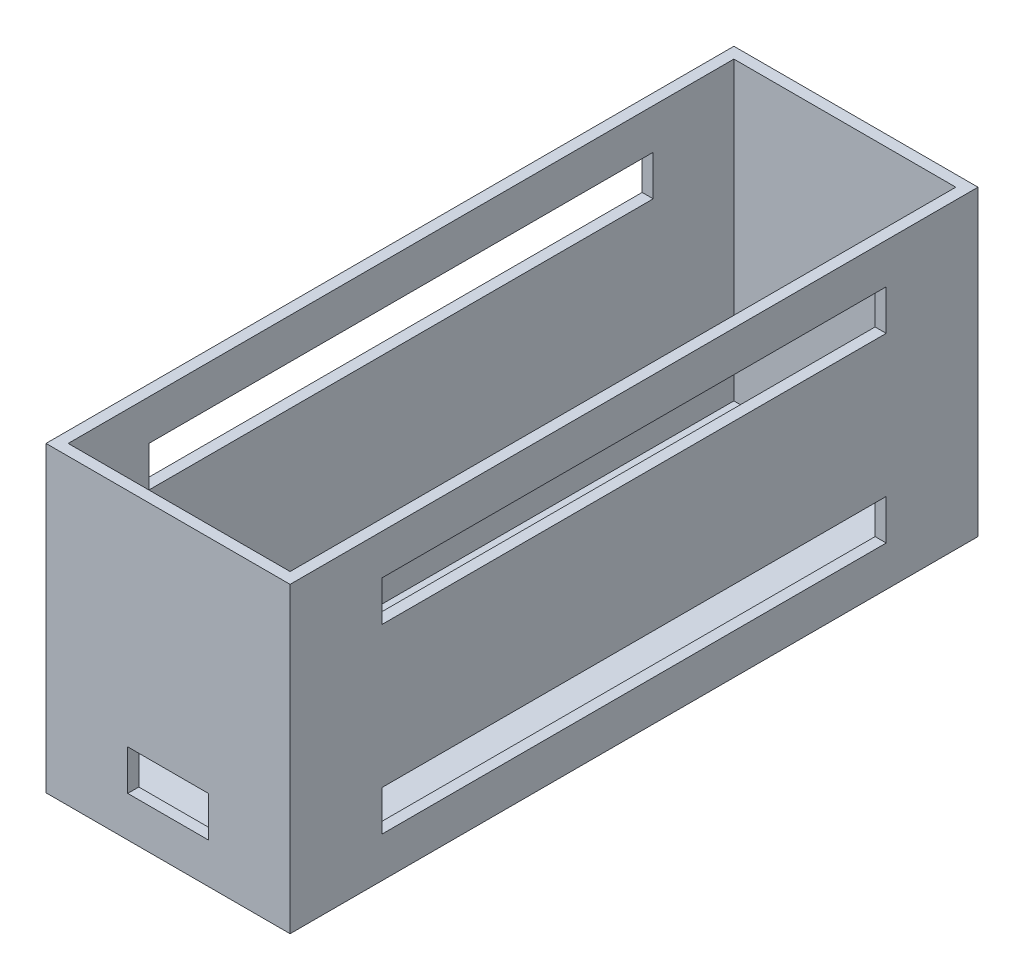
ISO-10303-21;
HEADER;
FILE_DESCRIPTION(('STEP AP214'),'2;1');
FILE_NAME('part.step','',(''),(''),'','','');
FILE_SCHEMA(('AUTOMOTIVE_DESIGN { 1 0 10303 214 1 1 1 1 }'));
ENDSEC;
DATA;
#1=APPLICATION_CONTEXT('core data for automotive mechanical design processes');
#2=APPLICATION_PROTOCOL_DEFINITION('international standard','automotive_design',2000,#1);
#3=PRODUCT_CONTEXT('',#1,'mechanical');
#4=PRODUCT('Part','Part','',(#3));
#5=PRODUCT_RELATED_PRODUCT_CATEGORY('part','',(#4));
#6=PRODUCT_DEFINITION_FORMATION('','',#4);
#7=PRODUCT_DEFINITION_CONTEXT('part definition',#1,'design');
#8=PRODUCT_DEFINITION('design','',#6,#7);
#9=PRODUCT_DEFINITION_SHAPE('','',#8);
#10=(LENGTH_UNIT() NAMED_UNIT(*) SI_UNIT(.MILLI.,.METRE.));
#11=(NAMED_UNIT(*) PLANE_ANGLE_UNIT() SI_UNIT($,.RADIAN.));
#12=(NAMED_UNIT(*) SI_UNIT($,.STERADIAN.) SOLID_ANGLE_UNIT());
#13=UNCERTAINTY_MEASURE_WITH_UNIT(LENGTH_MEASURE(1.E-05),#10,'distance_accuracy_value','');
#14=(GEOMETRIC_REPRESENTATION_CONTEXT(3) GLOBAL_UNCERTAINTY_ASSIGNED_CONTEXT((#13)) GLOBAL_UNIT_ASSIGNED_CONTEXT((#10,
#11,#12)) REPRESENTATION_CONTEXT('',''));
#15=CARTESIAN_POINT('',(0.,0.,0.));
#16=DIRECTION('',(0.,0.,1.));
#17=DIRECTION('',(1.,0.,0.));
#18=AXIS2_PLACEMENT_3D('',#15,#16,#17);
#19=CARTESIAN_POINT('',(-30.25,-37.5,85.25));
#20=DIRECTION('',(1.,0.,0.));
#21=DIRECTION('',(0.,0.,-1.));
#22=AXIS2_PLACEMENT_3D('',#19,#20,#21);
#23=PLANE('',#22);
#24=DIRECTION('',(0.,-1.,0.));
#25=VECTOR('',#24,1.);
#26=CARTESIAN_POINT('',(-30.25,-37.5,-85.25));
#27=LINE('',#26,#25);
#28=CARTESIAN_POINT('',(-30.25,37.5,-85.25));
#29=VERTEX_POINT('',#28);
#30=CARTESIAN_POINT('',(-30.25,-37.5,-85.25));
#31=VERTEX_POINT('',#30);
#32=EDGE_CURVE('E443',#29,#31,#27,.T.);
#33=ORIENTED_EDGE('',*,*,#32,.T.);
#34=DIRECTION('',(0.,0.,-1.));
#35=VECTOR('',#34,1.);
#36=CARTESIAN_POINT('',(-30.25,-37.5,85.25));
#37=LINE('',#36,#35);
#38=CARTESIAN_POINT('',(-30.25,-37.5,85.25));
#39=VERTEX_POINT('',#38);
#40=EDGE_CURVE('E490',#39,#31,#37,.T.);
#41=ORIENTED_EDGE('',*,*,#40,.F.);
#42=DIRECTION('',(0.,-1.,0.));
#43=VECTOR('',#42,1.);
#44=CARTESIAN_POINT('',(-30.25,-37.5,85.25));
#45=LINE('',#44,#43);
#46=CARTESIAN_POINT('',(-30.25,37.5,85.25));
#47=VERTEX_POINT('',#46);
#48=EDGE_CURVE('E453',#47,#39,#45,.T.);
#49=ORIENTED_EDGE('',*,*,#48,.F.);
#50=DIRECTION('',(0.,0.,-1.));
#51=VECTOR('',#50,1.);
#52=CARTESIAN_POINT('',(-30.25,37.5,85.25));
#53=LINE('',#52,#51);
#54=EDGE_CURVE('E467',#47,#29,#53,.T.);
#55=ORIENTED_EDGE('',*,*,#54,.T.);
#56=EDGE_LOOP('',(#33,#41,#49,#55));
#57=FACE_BOUND('',#56,.T.);
#58=DIRECTION('',(0.,1.,0.));
#59=VECTOR('',#58,1.);
#60=CARTESIAN_POINT('',(-30.25,-27.5,-62.5));
#61=LINE('',#60,#59);
#62=CARTESIAN_POINT('',(-30.25,-27.5,-62.5));
#63=VERTEX_POINT('',#62);
#64=CARTESIAN_POINT('',(-30.25,-17.5,-62.5));
#65=VERTEX_POINT('',#64);
#66=EDGE_CURVE('E320',#63,#65,#61,.T.);
#67=ORIENTED_EDGE('',*,*,#66,.T.);
#68=DIRECTION('',(0.,0.,-1.));
#69=VECTOR('',#68,1.);
#70=CARTESIAN_POINT('',(-30.25,-17.5,62.5));
#71=LINE('',#70,#69);
#72=CARTESIAN_POINT('',(-30.25,-17.5,62.5));
#73=VERTEX_POINT('',#72);
#74=EDGE_CURVE('E68',#73,#65,#71,.T.);
#75=ORIENTED_EDGE('',*,*,#74,.F.);
#76=DIRECTION('',(0.,1.,0.));
#77=VECTOR('',#76,1.);
#78=CARTESIAN_POINT('',(-30.25,-27.5,62.5));
#79=LINE('',#78,#77);
#80=CARTESIAN_POINT('',(-30.25,-27.5,62.5));
#81=VERTEX_POINT('',#80);
#82=EDGE_CURVE('E311',#81,#73,#79,.T.);
#83=ORIENTED_EDGE('',*,*,#82,.F.);
#84=DIRECTION('',(0.,0.,-1.));
#85=VECTOR('',#84,1.);
#86=CARTESIAN_POINT('',(-30.25,-27.5,62.5));
#87=LINE('',#86,#85);
#88=EDGE_CURVE('E315',#81,#63,#87,.T.);
#89=ORIENTED_EDGE('',*,*,#88,.T.);
#90=EDGE_LOOP('',(#67,#75,#83,#89));
#91=FACE_BOUND('',#90,.T.);
#92=DIRECTION('',(0.,-1.,0.));
#93=VECTOR('',#92,1.);
#94=CARTESIAN_POINT('',(-30.25,27.5,62.5));
#95=LINE('',#94,#93);
#96=CARTESIAN_POINT('',(-30.25,27.5,62.5));
#97=VERTEX_POINT('',#96);
#98=CARTESIAN_POINT('',(-30.25,17.5,62.5));
#99=VERTEX_POINT('',#98);
#100=EDGE_CURVE('E60',#97,#99,#95,.T.);
#101=ORIENTED_EDGE('',*,*,#100,.T.);
#102=DIRECTION('',(0.,0.,-1.));
#103=VECTOR('',#102,1.);
#104=CARTESIAN_POINT('',(-30.25,17.5,62.5));
#105=LINE('',#104,#103);
#106=CARTESIAN_POINT('',(-30.25,17.5,-62.5));
#107=VERTEX_POINT('',#106);
#108=EDGE_CURVE('E269',#99,#107,#105,.T.);
#109=ORIENTED_EDGE('',*,*,#108,.T.);
#110=DIRECTION('',(0.,-1.,0.));
#111=VECTOR('',#110,1.);
#112=CARTESIAN_POINT('',(-30.25,27.5,-62.5));
#113=LINE('',#112,#111);
#114=CARTESIAN_POINT('',(-30.25,27.5,-62.5));
#115=VERTEX_POINT('',#114);
#116=EDGE_CURVE('E273',#115,#107,#113,.T.);
#117=ORIENTED_EDGE('',*,*,#116,.F.);
#118=DIRECTION('',(0.,0.,-1.));
#119=VECTOR('',#118,1.);
#120=CARTESIAN_POINT('',(-30.25,27.5,62.5));
#121=LINE('',#120,#119);
#122=EDGE_CURVE('E244',#97,#115,#121,.T.);
#123=ORIENTED_EDGE('',*,*,#122,.F.);
#124=EDGE_LOOP('',(#101,#109,#117,#123));
#125=FACE_BOUND('',#124,.T.);
#126=ADVANCED_FACE('F45',(#57,#91,#125),#23,.F.);
#127=CARTESIAN_POINT('',(30.25,-37.5,85.25));
#128=DIRECTION('',(-1.,0.,0.));
#129=DIRECTION('',(0.,0.,1.));
#130=AXIS2_PLACEMENT_3D('',#127,#128,#129);
#131=PLANE('',#130);
#132=DIRECTION('',(0.,1.,0.));
#133=VECTOR('',#132,1.);
#134=CARTESIAN_POINT('',(30.25,-37.5,-85.25));
#135=LINE('',#134,#133);
#136=CARTESIAN_POINT('',(30.25,-37.5,-85.25));
#137=VERTEX_POINT('',#136);
#138=CARTESIAN_POINT('',(30.25,37.5,-85.25));
#139=VERTEX_POINT('',#138);
#140=EDGE_CURVE('E474',#137,#139,#135,.T.);
#141=ORIENTED_EDGE('',*,*,#140,.T.);
#142=DIRECTION('',(0.,0.,-1.));
#143=VECTOR('',#142,1.);
#144=CARTESIAN_POINT('',(30.25,37.5,85.25));
#145=LINE('',#144,#143);
#146=CARTESIAN_POINT('',(30.25,37.5,85.25));
#147=VERTEX_POINT('',#146);
#148=EDGE_CURVE('E482',#147,#139,#145,.T.);
#149=ORIENTED_EDGE('',*,*,#148,.F.);
#150=DIRECTION('',(0.,1.,0.));
#151=VECTOR('',#150,1.);
#152=CARTESIAN_POINT('',(30.25,-37.5,85.25));
#153=LINE('',#152,#151);
#154=CARTESIAN_POINT('',(30.25,-37.5,85.25));
#155=VERTEX_POINT('',#154);
#156=EDGE_CURVE('E461',#155,#147,#153,.T.);
#157=ORIENTED_EDGE('',*,*,#156,.F.);
#158=DIRECTION('',(0.,0.,-1.));
#159=VECTOR('',#158,1.);
#160=CARTESIAN_POINT('',(30.25,-37.5,85.25));
#161=LINE('',#160,#159);
#162=EDGE_CURVE('E486',#155,#137,#161,.T.);
#163=ORIENTED_EDGE('',*,*,#162,.T.);
#164=EDGE_LOOP('',(#141,#149,#157,#163));
#165=FACE_BOUND('',#164,.T.);
#166=DIRECTION('',(0.,1.,0.));
#167=VECTOR('',#166,1.);
#168=CARTESIAN_POINT('',(30.25,-27.5,62.5));
#169=LINE('',#168,#167);
#170=CARTESIAN_POINT('',(30.25,-27.5,62.5));
#171=VERTEX_POINT('',#170);
#172=CARTESIAN_POINT('',(30.25,-17.5,62.5));
#173=VERTEX_POINT('',#172);
#174=EDGE_CURVE('E294',#171,#173,#169,.T.);
#175=ORIENTED_EDGE('',*,*,#174,.T.);
#176=DIRECTION('',(0.,0.,-1.));
#177=VECTOR('',#176,1.);
#178=CARTESIAN_POINT('',(30.25,-17.5,62.5));
#179=LINE('',#178,#177);
#180=CARTESIAN_POINT('',(30.25,-17.5,-62.5));
#181=VERTEX_POINT('',#180);
#182=EDGE_CURVE('E316',#173,#181,#179,.T.);
#183=ORIENTED_EDGE('',*,*,#182,.T.);
#184=DIRECTION('',(0.,1.,0.));
#185=VECTOR('',#184,1.);
#186=CARTESIAN_POINT('',(30.25,-27.5,-62.5));
#187=LINE('',#186,#185);
#188=CARTESIAN_POINT('',(30.25,-27.5,-62.5));
#189=VERTEX_POINT('',#188);
#190=EDGE_CURVE('E333',#189,#181,#187,.T.);
#191=ORIENTED_EDGE('',*,*,#190,.F.);
#192=DIRECTION('',(0.,0.,-1.));
#193=VECTOR('',#192,1.);
#194=CARTESIAN_POINT('',(30.25,-27.5,62.5));
#195=LINE('',#194,#193);
#196=EDGE_CURVE('E329',#171,#189,#195,.T.);
#197=ORIENTED_EDGE('',*,*,#196,.F.);
#198=EDGE_LOOP('',(#175,#183,#191,#197));
#199=FACE_BOUND('',#198,.T.);
#200=DIRECTION('',(0.,-1.,0.));
#201=VECTOR('',#200,1.);
#202=CARTESIAN_POINT('',(30.25,27.5,62.5));
#203=LINE('',#202,#201);
#204=CARTESIAN_POINT('',(30.25,27.5,62.5));
#205=VERTEX_POINT('',#204);
#206=CARTESIAN_POINT('',(30.25,17.5,62.5));
#207=VERTEX_POINT('',#206);
#208=EDGE_CURVE('E232',#205,#207,#203,.T.);
#209=ORIENTED_EDGE('',*,*,#208,.F.);
#210=DIRECTION('',(0.,0.,-1.));
#211=VECTOR('',#210,1.);
#212=CARTESIAN_POINT('',(30.25,27.5,62.5));
#213=LINE('',#212,#211);
#214=CARTESIAN_POINT('',(30.25,27.5,-62.5));
#215=VERTEX_POINT('',#214);
#216=EDGE_CURVE('E261',#205,#215,#213,.T.);
#217=ORIENTED_EDGE('',*,*,#216,.T.);
#218=DIRECTION('',(0.,-1.,0.));
#219=VECTOR('',#218,1.);
#220=CARTESIAN_POINT('',(30.25,27.5,-62.5));
#221=LINE('',#220,#219);
#222=CARTESIAN_POINT('',(30.25,17.5,-62.5));
#223=VERTEX_POINT('',#222);
#224=EDGE_CURVE('E257',#215,#223,#221,.T.);
#225=ORIENTED_EDGE('',*,*,#224,.T.);
#226=DIRECTION('',(0.,0.,-1.));
#227=VECTOR('',#226,1.);
#228=CARTESIAN_POINT('',(30.25,17.5,62.5));
#229=LINE('',#228,#227);
#230=EDGE_CURVE('E243',#207,#223,#229,.T.);
#231=ORIENTED_EDGE('',*,*,#230,.F.);
#232=EDGE_LOOP('',(#209,#217,#225,#231));
#233=FACE_BOUND('',#232,.T.);
#234=ADVANCED_FACE('F256',(#165,#199,#233),#131,.F.);
#235=CARTESIAN_POINT('',(-27.5,-35.875,82.5));
#236=DIRECTION('',(-1.,0.,0.));
#237=DIRECTION('',(0.,-1.,0.));
#238=AXIS2_PLACEMENT_3D('',#235,#236,#237);
#239=PLANE('',#238);
#240=DIRECTION('',(0.,0.,1.));
#241=VECTOR('',#240,1.);
#242=CARTESIAN_POINT('',(-27.5,37.5,82.5));
#243=LINE('',#242,#241);
#244=CARTESIAN_POINT('',(-27.5,37.5,-82.5));
#245=VERTEX_POINT('',#244);
#246=CARTESIAN_POINT('',(-27.5,37.5,82.5));
#247=VERTEX_POINT('',#246);
#248=EDGE_CURVE('E408',#245,#247,#243,.T.);
#249=ORIENTED_EDGE('',*,*,#248,.T.);
#250=DIRECTION('',(0.,1.,0.));
#251=VECTOR('',#250,1.);
#252=CARTESIAN_POINT('',(-27.5,-35.875,82.5));
#253=LINE('',#252,#251);
#254=CARTESIAN_POINT('',(-27.5,-35.875,82.5));
#255=VERTEX_POINT('',#254);
#256=EDGE_CURVE('E426',#255,#247,#253,.T.);
#257=ORIENTED_EDGE('',*,*,#256,.F.);
#258=DIRECTION('',(0.,0.,1.));
#259=VECTOR('',#258,1.);
#260=CARTESIAN_POINT('',(-27.5,-35.875,82.5));
#261=LINE('',#260,#259);
#262=CARTESIAN_POINT('',(-27.5,-35.875,-82.5));
#263=VERTEX_POINT('',#262);
#264=EDGE_CURVE('E409',#263,#255,#261,.T.);
#265=ORIENTED_EDGE('',*,*,#264,.F.);
#266=DIRECTION('',(0.,1.,0.));
#267=VECTOR('',#266,1.);
#268=CARTESIAN_POINT('',(-27.5,-35.875,-82.5));
#269=LINE('',#268,#267);
#270=EDGE_CURVE('E440',#263,#245,#269,.T.);
#271=ORIENTED_EDGE('',*,*,#270,.T.);
#272=EDGE_LOOP('',(#249,#257,#265,#271));
#273=FACE_BOUND('',#272,.T.);
#274=DIRECTION('',(0.,1.,0.));
#275=VECTOR('',#274,1.);
#276=CARTESIAN_POINT('',(-27.5,-35.875,62.5));
#277=LINE('',#276,#275);
#278=CARTESIAN_POINT('',(-27.5,-27.5,62.5));
#279=VERTEX_POINT('',#278);
#280=CARTESIAN_POINT('',(-27.5,-17.5,62.5));
#281=VERTEX_POINT('',#280);
#282=EDGE_CURVE('E345',#279,#281,#277,.T.);
#283=ORIENTED_EDGE('',*,*,#282,.T.);
#284=DIRECTION('',(0.,0.,-1.));
#285=VECTOR('',#284,1.);
#286=CARTESIAN_POINT('',(-27.5,-17.5,82.5));
#287=LINE('',#286,#285);
#288=CARTESIAN_POINT('',(-27.5,-17.5,-62.5));
#289=VERTEX_POINT('',#288);
#290=EDGE_CURVE('E349',#281,#289,#287,.T.);
#291=ORIENTED_EDGE('',*,*,#290,.T.);
#292=DIRECTION('',(0.,1.,0.));
#293=VECTOR('',#292,1.);
#294=CARTESIAN_POINT('',(-27.5,-35.875,-62.5));
#295=LINE('',#294,#293);
#296=CARTESIAN_POINT('',(-27.5,-27.5,-62.5));
#297=VERTEX_POINT('',#296);
#298=EDGE_CURVE('E252',#297,#289,#295,.T.);
#299=ORIENTED_EDGE('',*,*,#298,.F.);
#300=DIRECTION('',(0.,0.,-1.));
#301=VECTOR('',#300,1.);
#302=CARTESIAN_POINT('',(-27.5,-27.5,82.5));
#303=LINE('',#302,#301);
#304=EDGE_CURVE('E341',#279,#297,#303,.T.);
#305=ORIENTED_EDGE('',*,*,#304,.F.);
#306=EDGE_LOOP('',(#283,#291,#299,#305));
#307=FACE_BOUND('',#306,.T.);
#308=DIRECTION('',(0.,-1.,0.));
#309=VECTOR('',#308,1.);
#310=CARTESIAN_POINT('',(-27.5,-35.875,62.5));
#311=LINE('',#310,#309);
#312=CARTESIAN_POINT('',(-27.5,27.5,62.5));
#313=VERTEX_POINT('',#312);
#314=CARTESIAN_POINT('',(-27.5,17.5,62.5));
#315=VERTEX_POINT('',#314);
#316=EDGE_CURVE('E364',#313,#315,#311,.T.);
#317=ORIENTED_EDGE('',*,*,#316,.F.);
#318=DIRECTION('',(0.,0.,-1.));
#319=VECTOR('',#318,1.);
#320=CARTESIAN_POINT('',(-27.5,27.5,82.5));
#321=LINE('',#320,#319);
#322=CARTESIAN_POINT('',(-27.5,27.5,-62.5));
#323=VERTEX_POINT('',#322);
#324=EDGE_CURVE('E353',#313,#323,#321,.T.);
#325=ORIENTED_EDGE('',*,*,#324,.T.);
#326=DIRECTION('',(0.,-1.,0.));
#327=VECTOR('',#326,1.);
#328=CARTESIAN_POINT('',(-27.5,-35.875,-62.5));
#329=LINE('',#328,#327);
#330=CARTESIAN_POINT('',(-27.5,17.5,-62.5));
#331=VERTEX_POINT('',#330);
#332=EDGE_CURVE('E357',#323,#331,#329,.T.);
#333=ORIENTED_EDGE('',*,*,#332,.T.);
#334=DIRECTION('',(0.,0.,-1.));
#335=VECTOR('',#334,1.);
#336=CARTESIAN_POINT('',(-27.5,17.5,82.5));
#337=LINE('',#336,#335);
#338=EDGE_CURVE('E361',#315,#331,#337,.T.);
#339=ORIENTED_EDGE('',*,*,#338,.F.);
#340=EDGE_LOOP('',(#317,#325,#333,#339));
#341=FACE_BOUND('',#340,.T.);
#342=ADVANCED_FACE('F533',(#273,#307,#341),#239,.F.);
#343=CARTESIAN_POINT('',(27.5,-35.875,82.5));
#344=DIRECTION('',(1.,0.,0.));
#345=DIRECTION('',(0.,1.,0.));
#346=AXIS2_PLACEMENT_3D('',#343,#344,#345);
#347=PLANE('',#346);
#348=DIRECTION('',(0.,0.,-1.));
#349=VECTOR('',#348,1.);
#350=CARTESIAN_POINT('',(27.5,37.5,82.5));
#351=LINE('',#350,#349);
#352=CARTESIAN_POINT('',(27.5,37.5,82.5));
#353=VERTEX_POINT('',#352);
#354=CARTESIAN_POINT('',(27.5,37.5,-82.5));
#355=VERTEX_POINT('',#354);
#356=EDGE_CURVE('E433',#353,#355,#351,.T.);
#357=ORIENTED_EDGE('',*,*,#356,.T.);
#358=DIRECTION('',(0.,1.,0.));
#359=VECTOR('',#358,1.);
#360=CARTESIAN_POINT('',(27.5,-35.875,-82.5));
#361=LINE('',#360,#359);
#362=CARTESIAN_POINT('',(27.5,-35.875,-82.5));
#363=VERTEX_POINT('',#362);
#364=EDGE_CURVE('E444',#363,#355,#361,.T.);
#365=ORIENTED_EDGE('',*,*,#364,.F.);
#366=DIRECTION('',(0.,0.,-1.));
#367=VECTOR('',#366,1.);
#368=CARTESIAN_POINT('',(27.5,-35.875,82.5));
#369=LINE('',#368,#367);
#370=CARTESIAN_POINT('',(27.5,-35.875,82.5));
#371=VERTEX_POINT('',#370);
#372=EDGE_CURVE('E418',#371,#363,#369,.T.);
#373=ORIENTED_EDGE('',*,*,#372,.F.);
#374=DIRECTION('',(0.,1.,0.));
#375=VECTOR('',#374,1.);
#376=CARTESIAN_POINT('',(27.5,-35.875,82.5));
#377=LINE('',#376,#375);
#378=EDGE_CURVE('E447',#371,#353,#377,.T.);
#379=ORIENTED_EDGE('',*,*,#378,.T.);
#380=EDGE_LOOP('',(#357,#365,#373,#379));
#381=FACE_BOUND('',#380,.T.);
#382=DIRECTION('',(0.,-1.,0.));
#383=VECTOR('',#382,1.);
#384=CARTESIAN_POINT('',(27.5,-35.875,-62.5));
#385=LINE('',#384,#383);
#386=CARTESIAN_POINT('',(27.5,-17.5,-62.5));
#387=VERTEX_POINT('',#386);
#388=CARTESIAN_POINT('',(27.5,-27.5,-62.5));
#389=VERTEX_POINT('',#388);
#390=EDGE_CURVE('E494',#387,#389,#385,.T.);
#391=ORIENTED_EDGE('',*,*,#390,.F.);
#392=DIRECTION('',(0.,0.,1.));
#393=VECTOR('',#392,1.);
#394=CARTESIAN_POINT('',(27.5,-17.5,82.5));
#395=LINE('',#394,#393);
#396=CARTESIAN_POINT('',(27.5,-17.5,62.5));
#397=VERTEX_POINT('',#396);
#398=EDGE_CURVE('E504',#387,#397,#395,.T.);
#399=ORIENTED_EDGE('',*,*,#398,.T.);
#400=DIRECTION('',(0.,-1.,0.));
#401=VECTOR('',#400,1.);
#402=CARTESIAN_POINT('',(27.5,-35.875,62.5));
#403=LINE('',#402,#401);
#404=CARTESIAN_POINT('',(27.5,-27.5,62.5));
#405=VERTEX_POINT('',#404);
#406=EDGE_CURVE('E500',#397,#405,#403,.T.);
#407=ORIENTED_EDGE('',*,*,#406,.T.);
#408=DIRECTION('',(0.,0.,1.));
#409=VECTOR('',#408,1.);
#410=CARTESIAN_POINT('',(27.5,-27.5,82.5));
#411=LINE('',#410,#409);
#412=EDGE_CURVE('E497',#389,#405,#411,.T.);
#413=ORIENTED_EDGE('',*,*,#412,.F.);
#414=EDGE_LOOP('',(#391,#399,#407,#413));
#415=FACE_BOUND('',#414,.T.);
#416=DIRECTION('',(0.,1.,0.));
#417=VECTOR('',#416,1.);
#418=CARTESIAN_POINT('',(27.5,-35.875,62.5));
#419=LINE('',#418,#417);
#420=CARTESIAN_POINT('',(27.5,17.5,62.5));
#421=VERTEX_POINT('',#420);
#422=CARTESIAN_POINT('',(27.5,27.5,62.5));
#423=VERTEX_POINT('',#422);
#424=EDGE_CURVE('E11',#421,#423,#419,.T.);
#425=ORIENTED_EDGE('',*,*,#424,.F.);
#426=DIRECTION('',(0.,0.,1.));
#427=VECTOR('',#426,1.);
#428=CARTESIAN_POINT('',(27.5,17.5,82.5));
#429=LINE('',#428,#427);
#430=CARTESIAN_POINT('',(27.5,17.5,-62.5));
#431=VERTEX_POINT('',#430);
#432=EDGE_CURVE('E53',#431,#421,#429,.T.);
#433=ORIENTED_EDGE('',*,*,#432,.F.);
#434=DIRECTION('',(0.,1.,0.));
#435=VECTOR('',#434,1.);
#436=CARTESIAN_POINT('',(27.5,-35.875,-62.5));
#437=LINE('',#436,#435);
#438=CARTESIAN_POINT('',(27.5,27.5,-62.5));
#439=VERTEX_POINT('',#438);
#440=EDGE_CURVE('E512',#431,#439,#437,.T.);
#441=ORIENTED_EDGE('',*,*,#440,.T.);
#442=DIRECTION('',(0.,0.,1.));
#443=VECTOR('',#442,1.);
#444=CARTESIAN_POINT('',(27.5,27.5,82.5));
#445=LINE('',#444,#443);
#446=EDGE_CURVE('E508',#439,#423,#445,.T.);
#447=ORIENTED_EDGE('',*,*,#446,.T.);
#448=EDGE_LOOP('',(#425,#433,#441,#447));
#449=FACE_BOUND('',#448,.T.);
#450=ADVANCED_FACE('F579',(#381,#415,#449),#347,.F.);
#451=CARTESIAN_POINT('',(30.25,-37.5,85.25));
#452=DIRECTION('',(0.,1.,0.));
#453=DIRECTION('',(-1.,0.,0.));
#454=AXIS2_PLACEMENT_3D('',#451,#452,#453);
#455=PLANE('',#454);
#456=DIRECTION('',(1.,0.,0.));
#457=VECTOR('',#456,1.);
#458=CARTESIAN_POINT('',(30.25,-37.5,-85.25));
#459=LINE('',#458,#457);
#460=EDGE_CURVE('E471',#31,#137,#459,.T.);
#461=ORIENTED_EDGE('',*,*,#460,.T.);
#462=ORIENTED_EDGE('',*,*,#162,.F.);
#463=DIRECTION('',(1.,0.,0.));
#464=VECTOR('',#463,1.);
#465=CARTESIAN_POINT('',(30.25,-37.5,85.25));
#466=LINE('',#465,#464);
#467=EDGE_CURVE('E457',#39,#155,#466,.T.);
#468=ORIENTED_EDGE('',*,*,#467,.F.);
#469=ORIENTED_EDGE('',*,*,#40,.T.);
#470=EDGE_LOOP('',(#461,#462,#468,#469));
#471=FACE_BOUND('',#470,.T.);
#472=ADVANCED_FACE('F585',(#471),#455,.F.);
#473=CARTESIAN_POINT('',(30.25,37.5,85.25));
#474=DIRECTION('',(0.,-1.,0.));
#475=DIRECTION('',(0.,0.,-1.));
#476=AXIS2_PLACEMENT_3D('',#473,#474,#475);
#477=PLANE('',#476);
#478=DIRECTION('',(1.,0.,0.));
#479=VECTOR('',#478,1.);
#480=CARTESIAN_POINT('',(27.5,37.5,82.5));
#481=LINE('',#480,#479);
#482=EDGE_CURVE('E429',#247,#353,#481,.T.);
#483=ORIENTED_EDGE('',*,*,#482,.F.);
#484=ORIENTED_EDGE('',*,*,#248,.F.);
#485=DIRECTION('',(-1.,0.,0.));
#486=VECTOR('',#485,1.);
#487=CARTESIAN_POINT('',(27.5,37.5,-82.5));
#488=LINE('',#487,#486);
#489=EDGE_CURVE('E414',#355,#245,#488,.T.);
#490=ORIENTED_EDGE('',*,*,#489,.F.);
#491=ORIENTED_EDGE('',*,*,#356,.F.);
#492=EDGE_LOOP('',(#483,#484,#490,#491));
#493=FACE_BOUND('',#492,.T.);
#494=DIRECTION('',(-1.,0.,0.));
#495=VECTOR('',#494,1.);
#496=CARTESIAN_POINT('',(30.25,37.5,-85.25));
#497=LINE('',#496,#495);
#498=EDGE_CURVE('E458',#139,#29,#497,.T.);
#499=ORIENTED_EDGE('',*,*,#498,.T.);
#500=ORIENTED_EDGE('',*,*,#54,.F.);
#501=DIRECTION('',(-1.,0.,0.));
#502=VECTOR('',#501,1.);
#503=CARTESIAN_POINT('',(30.25,37.5,85.25));
#504=LINE('',#503,#502);
#505=EDGE_CURVE('E464',#147,#47,#504,.T.);
#506=ORIENTED_EDGE('',*,*,#505,.F.);
#507=ORIENTED_EDGE('',*,*,#148,.T.);
#508=EDGE_LOOP('',(#499,#500,#506,#507));
#509=FACE_BOUND('',#508,.T.);
#510=ADVANCED_FACE('F595',(#493,#509),#477,.F.);
#511=CARTESIAN_POINT('',(0.,0.,85.25));
#512=DIRECTION('',(0.,0.,1.));
#513=DIRECTION('',(1.,0.,0.));
#514=AXIS2_PLACEMENT_3D('',#511,#512,#513);
#515=PLANE('',#514);
#516=DIRECTION('',(0.,-1.,0.));
#517=VECTOR('',#516,1.);
#518=CARTESIAN_POINT('',(-9.99999999999999,-27.5,85.25));
#519=LINE('',#518,#517);
#520=CARTESIAN_POINT('',(-9.99999999999999,-17.5,85.25));
#521=VERTEX_POINT('',#520);
#522=CARTESIAN_POINT('',(-9.99999999999999,-27.5,85.25));
#523=VERTEX_POINT('',#522);
#524=EDGE_CURVE('E367',#521,#523,#519,.T.);
#525=ORIENTED_EDGE('',*,*,#524,.F.);
#526=DIRECTION('',(-1.,0.,0.));
#527=VECTOR('',#526,1.);
#528=CARTESIAN_POINT('',(10.,-17.5,85.25));
#529=LINE('',#528,#527);
#530=CARTESIAN_POINT('',(10.,-17.5,85.25));
#531=VERTEX_POINT('',#530);
#532=EDGE_CURVE('E390',#531,#521,#529,.T.);
#533=ORIENTED_EDGE('',*,*,#532,.F.);
#534=DIRECTION('',(0.,1.,0.));
#535=VECTOR('',#534,1.);
#536=CARTESIAN_POINT('',(10.,-27.5,85.25));
#537=LINE('',#536,#535);
#538=CARTESIAN_POINT('',(10.,-27.5,85.25));
#539=VERTEX_POINT('',#538);
#540=EDGE_CURVE('E386',#539,#531,#537,.T.);
#541=ORIENTED_EDGE('',*,*,#540,.F.);
#542=DIRECTION('',(1.,0.,0.));
#543=VECTOR('',#542,1.);
#544=CARTESIAN_POINT('',(10.,-27.5,85.25));
#545=LINE('',#544,#543);
#546=EDGE_CURVE('E382',#523,#539,#545,.T.);
#547=ORIENTED_EDGE('',*,*,#546,.F.);
#548=EDGE_LOOP('',(#525,#533,#541,#547));
#549=FACE_BOUND('',#548,.T.);
#550=ORIENTED_EDGE('',*,*,#48,.T.);
#551=ORIENTED_EDGE('',*,*,#467,.T.);
#552=ORIENTED_EDGE('',*,*,#156,.T.);
#553=ORIENTED_EDGE('',*,*,#505,.T.);
#554=EDGE_LOOP('',(#550,#551,#552,#553));
#555=FACE_BOUND('',#554,.T.);
#556=ADVANCED_FACE('F591',(#549,#555),#515,.T.);
#557=CARTESIAN_POINT('',(0.,0.,-85.25));
#558=DIRECTION('',(0.,0.,1.));
#559=DIRECTION('',(1.,0.,0.));
#560=AXIS2_PLACEMENT_3D('',#557,#558,#559);
#561=PLANE('',#560);
#562=ORIENTED_EDGE('',*,*,#32,.F.);
#563=ORIENTED_EDGE('',*,*,#498,.F.);
#564=ORIENTED_EDGE('',*,*,#140,.F.);
#565=ORIENTED_EDGE('',*,*,#460,.F.);
#566=EDGE_LOOP('',(#562,#563,#564,#565));
#567=FACE_BOUND('',#566,.T.);
#568=ADVANCED_FACE('F594',(#567),#561,.F.);
#569=CARTESIAN_POINT('',(27.5,-35.875,-82.5));
#570=DIRECTION('',(0.,0.,-1.));
#571=DIRECTION('',(-1.,0.,0.));
#572=AXIS2_PLACEMENT_3D('',#569,#570,#571);
#573=PLANE('',#572);
#574=ORIENTED_EDGE('',*,*,#489,.T.);
#575=ORIENTED_EDGE('',*,*,#270,.F.);
#576=DIRECTION('',(-1.,0.,0.));
#577=VECTOR('',#576,1.);
#578=CARTESIAN_POINT('',(27.5,-35.875,-82.5));
#579=LINE('',#578,#577);
#580=EDGE_CURVE('E422',#363,#263,#579,.T.);
#581=ORIENTED_EDGE('',*,*,#580,.F.);
#582=ORIENTED_EDGE('',*,*,#364,.T.);
#583=EDGE_LOOP('',(#574,#575,#581,#582));
#584=FACE_BOUND('',#583,.T.);
#585=ADVANCED_FACE('F599',(#584),#573,.F.);
#586=CARTESIAN_POINT('',(27.5,-35.875,82.5));
#587=DIRECTION('',(0.,0.,1.));
#588=DIRECTION('',(1.,0.,0.));
#589=AXIS2_PLACEMENT_3D('',#586,#587,#588);
#590=PLANE('',#589);
#591=DIRECTION('',(1.,0.,0.));
#592=VECTOR('',#591,1.);
#593=CARTESIAN_POINT('',(10.,-17.5,82.5));
#594=LINE('',#593,#592);
#595=CARTESIAN_POINT('',(-9.99999999999999,-17.5,82.5));
#596=VERTEX_POINT('',#595);
#597=CARTESIAN_POINT('',(10.,-17.5,82.5));
#598=VERTEX_POINT('',#597);
#599=EDGE_CURVE('E372',#596,#598,#594,.T.);
#600=ORIENTED_EDGE('',*,*,#599,.F.);
#601=DIRECTION('',(0.,1.,0.));
#602=VECTOR('',#601,1.);
#603=CARTESIAN_POINT('',(-9.99999999999999,-27.5,82.5));
#604=LINE('',#603,#602);
#605=CARTESIAN_POINT('',(-9.99999999999999,-27.5,82.5));
#606=VERTEX_POINT('',#605);
#607=EDGE_CURVE('E376',#606,#596,#604,.T.);
#608=ORIENTED_EDGE('',*,*,#607,.F.);
#609=DIRECTION('',(-1.,0.,0.));
#610=VECTOR('',#609,1.);
#611=CARTESIAN_POINT('',(10.,-27.5,82.5));
#612=LINE('',#611,#610);
#613=CARTESIAN_POINT('',(10.,-27.5,82.5));
#614=VERTEX_POINT('',#613);
#615=EDGE_CURVE('E379',#614,#606,#612,.T.);
#616=ORIENTED_EDGE('',*,*,#615,.F.);
#617=DIRECTION('',(0.,-1.,0.));
#618=VECTOR('',#617,1.);
#619=CARTESIAN_POINT('',(10.,-27.5,82.5));
#620=LINE('',#619,#618);
#621=EDGE_CURVE('E368',#598,#614,#620,.T.);
#622=ORIENTED_EDGE('',*,*,#621,.F.);
#623=EDGE_LOOP('',(#600,#608,#616,#622));
#624=FACE_BOUND('',#623,.T.);
#625=ORIENTED_EDGE('',*,*,#482,.T.);
#626=ORIENTED_EDGE('',*,*,#378,.F.);
#627=DIRECTION('',(1.,0.,0.));
#628=VECTOR('',#627,1.);
#629=CARTESIAN_POINT('',(27.5,-35.875,82.5));
#630=LINE('',#629,#628);
#631=EDGE_CURVE('E413',#255,#371,#630,.T.);
#632=ORIENTED_EDGE('',*,*,#631,.F.);
#633=ORIENTED_EDGE('',*,*,#256,.T.);
#634=EDGE_LOOP('',(#625,#626,#632,#633));
#635=FACE_BOUND('',#634,.T.);
#636=ADVANCED_FACE('F590',(#624,#635),#590,.F.);
#637=CARTESIAN_POINT('',(0.,-35.875,0.));
#638=DIRECTION('',(0.,1.,0.));
#639=DIRECTION('',(-1.,0.,0.));
#640=AXIS2_PLACEMENT_3D('',#637,#638,#639);
#641=PLANE('',#640);
#642=ORIENTED_EDGE('',*,*,#264,.T.);
#643=ORIENTED_EDGE('',*,*,#631,.T.);
#644=ORIENTED_EDGE('',*,*,#372,.T.);
#645=ORIENTED_EDGE('',*,*,#580,.T.);
#646=EDGE_LOOP('',(#642,#643,#644,#645));
#647=FACE_BOUND('',#646,.T.);
#648=ADVANCED_FACE('F804',(#647),#641,.T.);
#649=CARTESIAN_POINT('',(-9.99999999999999,-27.5,60.1393202250021));
#650=DIRECTION('',(-1.,0.,0.));
#651=DIRECTION('',(0.,0.,1.));
#652=AXIS2_PLACEMENT_3D('',#649,#650,#651);
#653=PLANE('',#652);
#654=ORIENTED_EDGE('',*,*,#607,.T.);
#655=DIRECTION('',(0.,0.,1.));
#656=VECTOR('',#655,1.);
#657=CARTESIAN_POINT('',(-9.99999999999999,-17.5,60.1393202250021));
#658=LINE('',#657,#656);
#659=EDGE_CURVE('E373',#596,#521,#658,.T.);
#660=ORIENTED_EDGE('',*,*,#659,.T.);
#661=ORIENTED_EDGE('',*,*,#524,.T.);
#662=DIRECTION('',(0.,0.,1.));
#663=VECTOR('',#662,1.);
#664=CARTESIAN_POINT('',(-9.99999999999999,-27.5,60.1393202250021));
#665=LINE('',#664,#663);
#666=EDGE_CURVE('E394',#606,#523,#665,.T.);
#667=ORIENTED_EDGE('',*,*,#666,.F.);
#668=EDGE_LOOP('',(#654,#660,#661,#667));
#669=FACE_BOUND('',#668,.T.);
#670=ADVANCED_FACE('F794',(#669),#653,.F.);
#671=CARTESIAN_POINT('',(10.,-17.5,60.1393202250021));
#672=DIRECTION('',(0.,1.,0.));
#673=DIRECTION('',(0.,0.,1.));
#674=AXIS2_PLACEMENT_3D('',#671,#672,#673);
#675=PLANE('',#674);
#676=ORIENTED_EDGE('',*,*,#599,.T.);
#677=DIRECTION('',(0.,0.,1.));
#678=VECTOR('',#677,1.);
#679=CARTESIAN_POINT('',(10.,-17.5,60.1393202250021));
#680=LINE('',#679,#678);
#681=EDGE_CURVE('E397',#598,#531,#680,.T.);
#682=ORIENTED_EDGE('',*,*,#681,.T.);
#683=ORIENTED_EDGE('',*,*,#532,.T.);
#684=ORIENTED_EDGE('',*,*,#659,.F.);
#685=EDGE_LOOP('',(#676,#682,#683,#684));
#686=FACE_BOUND('',#685,.T.);
#687=ADVANCED_FACE('F784',(#686),#675,.F.);
#688=CARTESIAN_POINT('',(10.,-27.5,60.1393202250021));
#689=DIRECTION('',(1.,0.,0.));
#690=DIRECTION('',(0.,0.,-1.));
#691=AXIS2_PLACEMENT_3D('',#688,#689,#690);
#692=PLANE('',#691);
#693=ORIENTED_EDGE('',*,*,#621,.T.);
#694=DIRECTION('',(0.,0.,1.));
#695=VECTOR('',#694,1.);
#696=CARTESIAN_POINT('',(10.,-27.5,60.1393202250021));
#697=LINE('',#696,#695);
#698=EDGE_CURVE('E400',#614,#539,#697,.T.);
#699=ORIENTED_EDGE('',*,*,#698,.T.);
#700=ORIENTED_EDGE('',*,*,#540,.T.);
#701=ORIENTED_EDGE('',*,*,#681,.F.);
#702=EDGE_LOOP('',(#693,#699,#700,#701));
#703=FACE_BOUND('',#702,.T.);
#704=ADVANCED_FACE('F774',(#703),#692,.F.);
#705=CARTESIAN_POINT('',(10.,-27.5,60.1393202250021));
#706=DIRECTION('',(0.,-1.,0.));
#707=DIRECTION('',(1.,0.,0.));
#708=AXIS2_PLACEMENT_3D('',#705,#706,#707);
#709=PLANE('',#708);
#710=ORIENTED_EDGE('',*,*,#615,.T.);
#711=ORIENTED_EDGE('',*,*,#666,.T.);
#712=ORIENTED_EDGE('',*,*,#546,.T.);
#713=ORIENTED_EDGE('',*,*,#698,.F.);
#714=EDGE_LOOP('',(#710,#711,#712,#713));
#715=FACE_BOUND('',#714,.T.);
#716=ADVANCED_FACE('F749',(#715),#709,.F.);
#717=CARTESIAN_POINT('',(30.25,-27.5,-62.5));
#718=DIRECTION('',(0.,0.,1.));
#719=DIRECTION('',(1.,0.,0.));
#720=AXIS2_PLACEMENT_3D('',#717,#718,#719);
#721=PLANE('',#720);
#722=ORIENTED_EDGE('',*,*,#390,.T.);
#723=DIRECTION('',(-1.,0.,0.));
#724=VECTOR('',#723,1.);
#725=CARTESIAN_POINT('',(30.25,-27.5,-62.5));
#726=LINE('',#725,#724);
#727=EDGE_CURVE('E296',#189,#389,#726,.T.);
#728=ORIENTED_EDGE('',*,*,#727,.F.);
#729=ORIENTED_EDGE('',*,*,#190,.T.);
#730=DIRECTION('',(-1.,0.,0.));
#731=VECTOR('',#730,1.);
#732=CARTESIAN_POINT('',(30.25,-17.5,-62.5));
#733=LINE('',#732,#731);
#734=EDGE_CURVE('E291',#181,#387,#733,.T.);
#735=ORIENTED_EDGE('',*,*,#734,.T.);
#736=EDGE_LOOP('',(#722,#728,#729,#735));
#737=FACE_BOUND('',#736,.T.);
#738=ADVANCED_FACE('F630',(#737),#721,.T.);
#739=CARTESIAN_POINT('',(30.25,-27.5,62.5));
#740=DIRECTION('',(0.,1.,0.));
#741=DIRECTION('',(0.,0.,1.));
#742=AXIS2_PLACEMENT_3D('',#739,#740,#741);
#743=PLANE('',#742);
#744=ORIENTED_EDGE('',*,*,#412,.T.);
#745=DIRECTION('',(-1.,0.,0.));
#746=VECTOR('',#745,1.);
#747=CARTESIAN_POINT('',(30.25,-27.5,62.5));
#748=LINE('',#747,#746);
#749=EDGE_CURVE('E301',#171,#405,#748,.T.);
#750=ORIENTED_EDGE('',*,*,#749,.F.);
#751=ORIENTED_EDGE('',*,*,#196,.T.);
#752=ORIENTED_EDGE('',*,*,#727,.T.);
#753=EDGE_LOOP('',(#744,#750,#751,#752));
#754=FACE_BOUND('',#753,.T.);
#755=ADVANCED_FACE('F633',(#754),#743,.T.);
#756=CARTESIAN_POINT('',(30.25,-27.5,62.5));
#757=DIRECTION('',(0.,0.,1.));
#758=DIRECTION('',(1.,0.,0.));
#759=AXIS2_PLACEMENT_3D('',#756,#757,#758);
#760=PLANE('',#759);
#761=DIRECTION('',(-1.,0.,0.));
#762=VECTOR('',#761,1.);
#763=CARTESIAN_POINT('',(30.25,-17.5,62.5));
#764=LINE('',#763,#762);
#765=EDGE_CURVE('E306',#173,#397,#764,.T.);
#766=ORIENTED_EDGE('',*,*,#765,.F.);
#767=ORIENTED_EDGE('',*,*,#174,.F.);
#768=ORIENTED_EDGE('',*,*,#749,.T.);
#769=ORIENTED_EDGE('',*,*,#406,.F.);
#770=EDGE_LOOP('',(#766,#767,#768,#769));
#771=FACE_BOUND('',#770,.T.);
#772=ADVANCED_FACE('F623',(#771),#760,.F.);
#773=CARTESIAN_POINT('',(30.25,-17.5,62.5));
#774=DIRECTION('',(0.,1.,0.));
#775=DIRECTION('',(0.,0.,1.));
#776=AXIS2_PLACEMENT_3D('',#773,#774,#775);
#777=PLANE('',#776);
#778=ORIENTED_EDGE('',*,*,#734,.F.);
#779=ORIENTED_EDGE('',*,*,#182,.F.);
#780=ORIENTED_EDGE('',*,*,#765,.T.);
#781=ORIENTED_EDGE('',*,*,#398,.F.);
#782=EDGE_LOOP('',(#778,#779,#780,#781));
#783=FACE_BOUND('',#782,.T.);
#784=ADVANCED_FACE('F627',(#783),#777,.F.);
#785=CARTESIAN_POINT('',(30.25,27.5,62.5));
#786=DIRECTION('',(0.,1.,0.));
#787=DIRECTION('',(0.,0.,1.));
#788=AXIS2_PLACEMENT_3D('',#785,#786,#787);
#789=PLANE('',#788);
#790=DIRECTION('',(-1.,0.,0.));
#791=VECTOR('',#790,1.);
#792=CARTESIAN_POINT('',(30.25,27.5,-62.5));
#793=LINE('',#792,#791);
#794=EDGE_CURVE('E283',#215,#439,#793,.T.);
#795=ORIENTED_EDGE('',*,*,#794,.F.);
#796=ORIENTED_EDGE('',*,*,#216,.F.);
#797=DIRECTION('',(-1.,0.,0.));
#798=VECTOR('',#797,1.);
#799=CARTESIAN_POINT('',(30.25,27.5,62.5));
#800=LINE('',#799,#798);
#801=EDGE_CURVE('E237',#205,#423,#800,.T.);
#802=ORIENTED_EDGE('',*,*,#801,.T.);
#803=ORIENTED_EDGE('',*,*,#446,.F.);
#804=EDGE_LOOP('',(#795,#796,#802,#803));
#805=FACE_BOUND('',#804,.T.);
#806=ADVANCED_FACE('F638',(#805),#789,.F.);
#807=CARTESIAN_POINT('',(30.25,27.5,-62.5));
#808=DIRECTION('',(0.,0.,-1.));
#809=DIRECTION('',(-1.,0.,0.));
#810=AXIS2_PLACEMENT_3D('',#807,#808,#809);
#811=PLANE('',#810);
#812=DIRECTION('',(-1.,0.,0.));
#813=VECTOR('',#812,1.);
#814=CARTESIAN_POINT('',(30.25,17.5,-62.5));
#815=LINE('',#814,#813);
#816=EDGE_CURVE('E288',#223,#431,#815,.T.);
#817=ORIENTED_EDGE('',*,*,#816,.F.);
#818=ORIENTED_EDGE('',*,*,#224,.F.);
#819=ORIENTED_EDGE('',*,*,#794,.T.);
#820=ORIENTED_EDGE('',*,*,#440,.F.);
#821=EDGE_LOOP('',(#817,#818,#819,#820));
#822=FACE_BOUND('',#821,.T.);
#823=ADVANCED_FACE('F545',(#822),#811,.F.);
#824=CARTESIAN_POINT('',(30.25,17.5,62.5));
#825=DIRECTION('',(0.,1.,0.));
#826=DIRECTION('',(0.,0.,1.));
#827=AXIS2_PLACEMENT_3D('',#824,#825,#826);
#828=PLANE('',#827);
#829=ORIENTED_EDGE('',*,*,#432,.T.);
#830=DIRECTION('',(-1.,0.,0.));
#831=VECTOR('',#830,1.);
#832=CARTESIAN_POINT('',(30.25,17.5,62.5));
#833=LINE('',#832,#831);
#834=EDGE_CURVE('E235',#207,#421,#833,.T.);
#835=ORIENTED_EDGE('',*,*,#834,.F.);
#836=ORIENTED_EDGE('',*,*,#230,.T.);
#837=ORIENTED_EDGE('',*,*,#816,.T.);
#838=EDGE_LOOP('',(#829,#835,#836,#837));
#839=FACE_BOUND('',#838,.T.);
#840=ADVANCED_FACE('F247',(#839),#828,.T.);
#841=CARTESIAN_POINT('',(30.25,27.5,62.5));
#842=DIRECTION('',(0.,0.,-1.));
#843=DIRECTION('',(-1.,0.,0.));
#844=AXIS2_PLACEMENT_3D('',#841,#842,#843);
#845=PLANE('',#844);
#846=ORIENTED_EDGE('',*,*,#424,.T.);
#847=ORIENTED_EDGE('',*,*,#801,.F.);
#848=ORIENTED_EDGE('',*,*,#208,.T.);
#849=ORIENTED_EDGE('',*,*,#834,.T.);
#850=EDGE_LOOP('',(#846,#847,#848,#849));
#851=FACE_BOUND('',#850,.T.);
#852=ADVANCED_FACE('F234',(#851),#845,.T.);
#853=EDGE_CURVE('E310',#281,#73,#764,.T.);
#854=ORIENTED_EDGE('',*,*,#853,.T.);
#855=ORIENTED_EDGE('',*,*,#74,.T.);
#856=EDGE_CURVE('E295',#289,#65,#733,.T.);
#857=ORIENTED_EDGE('',*,*,#856,.F.);
#858=ORIENTED_EDGE('',*,*,#290,.F.);
#859=EDGE_LOOP('',(#854,#855,#857,#858));
#860=FACE_BOUND('',#859,.T.);
#861=ADVANCED_FACE('F570',(#860),#777,.F.);
#862=EDGE_CURVE('E305',#279,#81,#748,.T.);
#863=ORIENTED_EDGE('',*,*,#862,.T.);
#864=ORIENTED_EDGE('',*,*,#82,.T.);
#865=ORIENTED_EDGE('',*,*,#853,.F.);
#866=ORIENTED_EDGE('',*,*,#282,.F.);
#867=EDGE_LOOP('',(#863,#864,#865,#866));
#868=FACE_BOUND('',#867,.T.);
#869=ADVANCED_FACE('F572',(#868),#760,.F.);
#870=ORIENTED_EDGE('',*,*,#304,.T.);
#871=EDGE_CURVE('E300',#297,#63,#726,.T.);
#872=ORIENTED_EDGE('',*,*,#871,.T.);
#873=ORIENTED_EDGE('',*,*,#88,.F.);
#874=ORIENTED_EDGE('',*,*,#862,.F.);
#875=EDGE_LOOP('',(#870,#872,#873,#874));
#876=FACE_BOUND('',#875,.T.);
#877=ADVANCED_FACE('F576',(#876),#743,.T.);
#878=ORIENTED_EDGE('',*,*,#298,.T.);
#879=ORIENTED_EDGE('',*,*,#856,.T.);
#880=ORIENTED_EDGE('',*,*,#66,.F.);
#881=ORIENTED_EDGE('',*,*,#871,.F.);
#882=EDGE_LOOP('',(#878,#879,#880,#881));
#883=FACE_BOUND('',#882,.T.);
#884=ADVANCED_FACE('F546',(#883),#721,.T.);
#885=ORIENTED_EDGE('',*,*,#316,.T.);
#886=EDGE_CURVE('E253',#315,#99,#833,.T.);
#887=ORIENTED_EDGE('',*,*,#886,.T.);
#888=ORIENTED_EDGE('',*,*,#100,.F.);
#889=EDGE_CURVE('E266',#313,#97,#800,.T.);
#890=ORIENTED_EDGE('',*,*,#889,.F.);
#891=EDGE_LOOP('',(#885,#887,#888,#890));
#892=FACE_BOUND('',#891,.T.);
#893=ADVANCED_FACE('F535',(#892),#845,.T.);
#894=ORIENTED_EDGE('',*,*,#338,.T.);
#895=EDGE_CURVE('E287',#331,#107,#815,.T.);
#896=ORIENTED_EDGE('',*,*,#895,.T.);
#897=ORIENTED_EDGE('',*,*,#108,.F.);
#898=ORIENTED_EDGE('',*,*,#886,.F.);
#899=EDGE_LOOP('',(#894,#896,#897,#898));
#900=FACE_BOUND('',#899,.T.);
#901=ADVANCED_FACE('F537',(#900),#828,.T.);
#902=EDGE_CURVE('E282',#323,#115,#793,.T.);
#903=ORIENTED_EDGE('',*,*,#902,.T.);
#904=ORIENTED_EDGE('',*,*,#116,.T.);
#905=ORIENTED_EDGE('',*,*,#895,.F.);
#906=ORIENTED_EDGE('',*,*,#332,.F.);
#907=EDGE_LOOP('',(#903,#904,#905,#906));
#908=FACE_BOUND('',#907,.T.);
#909=ADVANCED_FACE('F529',(#908),#811,.F.);
#910=ORIENTED_EDGE('',*,*,#889,.T.);
#911=ORIENTED_EDGE('',*,*,#122,.T.);
#912=ORIENTED_EDGE('',*,*,#902,.F.);
#913=ORIENTED_EDGE('',*,*,#324,.F.);
#914=EDGE_LOOP('',(#910,#911,#912,#913));
#915=FACE_BOUND('',#914,.T.);
#916=ADVANCED_FACE('F522',(#915),#789,.F.);
#917=CLOSED_SHELL('',(#126,#234,#342,#450,#472,#510,#556,#568,#585,#636,#648,#670,#687,#704,
#716,#738,#755,#772,#784,#806,#823,#840,#852,#861,#869,#877,#884,#893,#901,#909,#916));
#918=MANIFOLD_SOLID_BREP('B2',#917);
#919=ADVANCED_BREP_SHAPE_REPRESENTATION('',(#18,#918),#14);
#920=SHAPE_DEFINITION_REPRESENTATION(#9,#919);
ENDSEC;
END-ISO-10303-21;
